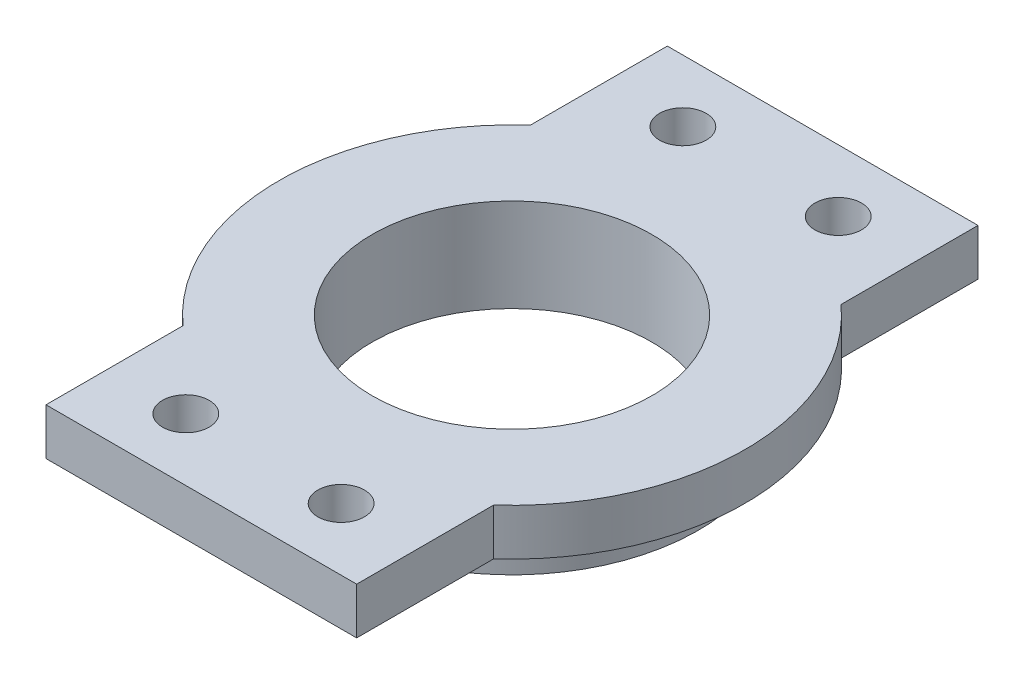
ISO-10303-21;
HEADER;
FILE_DESCRIPTION(('STEP AP214'),'2;1');
FILE_NAME('part.step','',(''),(''),'','','');
FILE_SCHEMA(('AUTOMOTIVE_DESIGN { 1 0 10303 214 1 1 1 1 }'));
ENDSEC;
DATA;
#1=APPLICATION_CONTEXT('core data for automotive mechanical design processes');
#2=APPLICATION_PROTOCOL_DEFINITION('international standard','automotive_design',2000,#1);
#3=PRODUCT_CONTEXT('',#1,'mechanical');
#4=PRODUCT('Part','Part','',(#3));
#5=PRODUCT_RELATED_PRODUCT_CATEGORY('part','',(#4));
#6=PRODUCT_DEFINITION_FORMATION('','',#4);
#7=PRODUCT_DEFINITION_CONTEXT('part definition',#1,'design');
#8=PRODUCT_DEFINITION('design','',#6,#7);
#9=PRODUCT_DEFINITION_SHAPE('','',#8);
#10=(LENGTH_UNIT() NAMED_UNIT(*) SI_UNIT(.MILLI.,.METRE.));
#11=(NAMED_UNIT(*) PLANE_ANGLE_UNIT() SI_UNIT($,.RADIAN.));
#12=(NAMED_UNIT(*) SI_UNIT($,.STERADIAN.) SOLID_ANGLE_UNIT());
#13=UNCERTAINTY_MEASURE_WITH_UNIT(LENGTH_MEASURE(1.E-05),#10,'distance_accuracy_value','');
#14=(GEOMETRIC_REPRESENTATION_CONTEXT(3) GLOBAL_UNCERTAINTY_ASSIGNED_CONTEXT((#13)) GLOBAL_UNIT_ASSIGNED_CONTEXT((#10,
#11,#12)) REPRESENTATION_CONTEXT('',''));
#15=CARTESIAN_POINT('',(0.,0.,0.));
#16=DIRECTION('',(0.,0.,1.));
#17=DIRECTION('',(1.,0.,0.));
#18=AXIS2_PLACEMENT_3D('',#15,#16,#17);
#19=CARTESIAN_POINT('',(0.,0.,0.));
#20=DIRECTION('',(0.,1.,0.));
#21=DIRECTION('',(0.,0.,1.));
#22=AXIS2_PLACEMENT_3D('',#19,#20,#21);
#23=PLANE('',#22);
#24=CARTESIAN_POINT('',(0.,0.,0.));
#25=DIRECTION('',(0.,1.,0.));
#26=DIRECTION('',(0.,0.,1.));
#27=AXIS2_PLACEMENT_3D('',#24,#25,#26);
#28=CIRCLE('',#27,12.);
#29=CARTESIAN_POINT('',(0.,0.,12.));
#30=VERTEX_POINT('',#29);
#31=EDGE_CURVE('E47',#30,#30,#28,.T.);
#32=ORIENTED_EDGE('',*,*,#31,.F.);
#33=EDGE_LOOP('',(#32));
#34=FACE_BOUND('',#33,.T.);
#35=CARTESIAN_POINT('',(0.,0.,0.));
#36=DIRECTION('',(0.,1.,0.));
#37=DIRECTION('',(0.,0.,1.));
#38=AXIS2_PLACEMENT_3D('',#35,#36,#37);
#39=CIRCLE('',#38,9.);
#40=CARTESIAN_POINT('',(0.,0.,9.));
#41=VERTEX_POINT('',#40);
#42=EDGE_CURVE('E194',#41,#41,#39,.T.);
#43=ORIENTED_EDGE('',*,*,#42,.T.);
#44=EDGE_LOOP('',(#43));
#45=FACE_BOUND('',#44,.T.);
#46=ADVANCED_FACE('F44',(#34,#45),#23,.F.);
#47=CARTESIAN_POINT('',(0.,3.,0.));
#48=DIRECTION('',(0.,-1.,0.));
#49=DIRECTION('',(0.,0.,-1.));
#50=AXIS2_PLACEMENT_3D('',#47,#48,#49);
#51=CYLINDRICAL_SURFACE('',#50,12.);
#52=CARTESIAN_POINT('',(0.,3.,0.));
#53=DIRECTION('',(0.,1.,0.));
#54=DIRECTION('',(0.,0.,1.));
#55=AXIS2_PLACEMENT_3D('',#52,#53,#54);
#56=CIRCLE('',#55,12.);
#57=CARTESIAN_POINT('',(0.,3.,12.));
#58=VERTEX_POINT('',#57);
#59=EDGE_CURVE('E11',#58,#58,#56,.T.);
#60=ORIENTED_EDGE('',*,*,#59,.F.);
#61=EDGE_LOOP('',(#60));
#62=FACE_BOUND('',#61,.T.);
#63=ORIENTED_EDGE('',*,*,#31,.T.);
#64=EDGE_LOOP('',(#63));
#65=FACE_BOUND('',#64,.T.);
#66=ADVANCED_FACE('F50',(#62,#65),#51,.T.);
#67=CARTESIAN_POINT('',(0.,3.,0.));
#68=DIRECTION('',(0.,-1.,0.));
#69=DIRECTION('',(0.,0.,-1.));
#70=AXIS2_PLACEMENT_3D('',#67,#68,#69);
#71=CYLINDRICAL_SURFACE('',#70,9.);
#72=ORIENTED_EDGE('',*,*,#42,.F.);
#73=EDGE_LOOP('',(#72));
#74=FACE_BOUND('',#73,.T.);
#75=CARTESIAN_POINT('',(0.,6.,0.));
#76=DIRECTION('',(0.,1.,0.));
#77=DIRECTION('',(0.,0.,1.));
#78=AXIS2_PLACEMENT_3D('',#75,#76,#77);
#79=CIRCLE('',#78,9.);
#80=CARTESIAN_POINT('',(0.,6.,9.));
#81=VERTEX_POINT('',#80);
#82=EDGE_CURVE('E152',#81,#81,#79,.T.);
#83=ORIENTED_EDGE('',*,*,#82,.T.);
#84=EDGE_LOOP('',(#83));
#85=FACE_BOUND('',#84,.T.);
#86=ADVANCED_FACE('F208',(#74,#85),#71,.F.);
#87=CARTESIAN_POINT('',(0.,6.,0.));
#88=DIRECTION('',(0.,1.,0.));
#89=DIRECTION('',(0.,0.,1.));
#90=AXIS2_PLACEMENT_3D('',#87,#88,#89);
#91=PLANE('',#90);
#92=CARTESIAN_POINT('',(-5.,6.,16.));
#93=DIRECTION('',(0.,1.,0.));
#94=DIRECTION('',(0.,0.,1.));
#95=AXIS2_PLACEMENT_3D('',#92,#93,#94);
#96=CIRCLE('',#95,1.5);
#97=CARTESIAN_POINT('',(-5.,6.,17.5));
#98=VERTEX_POINT('',#97);
#99=EDGE_CURVE('E279',#98,#98,#96,.T.);
#100=ORIENTED_EDGE('',*,*,#99,.F.);
#101=EDGE_LOOP('',(#100));
#102=FACE_BOUND('',#101,.T.);
#103=CARTESIAN_POINT('',(-5.,6.,-16.));
#104=DIRECTION('',(0.,1.,0.));
#105=DIRECTION('',(0.,0.,1.));
#106=AXIS2_PLACEMENT_3D('',#103,#104,#105);
#107=CIRCLE('',#106,1.5);
#108=CARTESIAN_POINT('',(-5.,6.,-14.5));
#109=VERTEX_POINT('',#108);
#110=EDGE_CURVE('E294',#109,#109,#107,.T.);
#111=ORIENTED_EDGE('',*,*,#110,.F.);
#112=EDGE_LOOP('',(#111));
#113=FACE_BOUND('',#112,.T.);
#114=CARTESIAN_POINT('',(0.,6.,0.));
#115=DIRECTION('',(0.,1.,0.));
#116=DIRECTION('',(0.,0.,1.));
#117=AXIS2_PLACEMENT_3D('',#114,#115,#116);
#118=CIRCLE('',#117,15.);
#119=CARTESIAN_POINT('',(-10.,6.,-11.1803398874989));
#120=VERTEX_POINT('',#119);
#121=CARTESIAN_POINT('',(-10.,6.,11.1803398874989));
#122=VERTEX_POINT('',#121);
#123=EDGE_CURVE('E174',#120,#122,#118,.T.);
#124=ORIENTED_EDGE('',*,*,#123,.T.);
#125=DIRECTION('',(0.,0.,1.));
#126=VECTOR('',#125,1.);
#127=CARTESIAN_POINT('',(-10.,6.,11.1803398874989));
#128=LINE('',#127,#126);
#129=CARTESIAN_POINT('',(-10.,6.,20.));
#130=VERTEX_POINT('',#129);
#131=EDGE_CURVE('E110',#122,#130,#128,.T.);
#132=ORIENTED_EDGE('',*,*,#131,.T.);
#133=DIRECTION('',(1.,0.,0.));
#134=VECTOR('',#133,1.);
#135=CARTESIAN_POINT('',(-10.,6.,20.));
#136=LINE('',#135,#134);
#137=CARTESIAN_POINT('',(10.,6.,20.));
#138=VERTEX_POINT('',#137);
#139=EDGE_CURVE('E306',#130,#138,#136,.T.);
#140=ORIENTED_EDGE('',*,*,#139,.T.);
#141=DIRECTION('',(0.,0.,-1.));
#142=VECTOR('',#141,1.);
#143=CARTESIAN_POINT('',(10.,6.,11.180339887499));
#144=LINE('',#143,#142);
#145=CARTESIAN_POINT('',(10.,6.,11.1803398874989));
#146=VERTEX_POINT('',#145);
#147=EDGE_CURVE('E313',#138,#146,#144,.T.);
#148=ORIENTED_EDGE('',*,*,#147,.T.);
#149=CARTESIAN_POINT('',(0.,6.,0.));
#150=DIRECTION('',(0.,1.,0.));
#151=DIRECTION('',(0.,0.,1.));
#152=AXIS2_PLACEMENT_3D('',#149,#150,#151);
#153=CIRCLE('',#152,15.);
#154=CARTESIAN_POINT('',(10.,6.,-11.180339887499));
#155=VERTEX_POINT('',#154);
#156=EDGE_CURVE('E130',#146,#155,#153,.T.);
#157=ORIENTED_EDGE('',*,*,#156,.T.);
#158=DIRECTION('',(0.,0.,-1.));
#159=VECTOR('',#158,1.);
#160=CARTESIAN_POINT('',(10.,6.,-20.));
#161=LINE('',#160,#159);
#162=CARTESIAN_POINT('',(10.,6.,-20.));
#163=VERTEX_POINT('',#162);
#164=EDGE_CURVE('E116',#155,#163,#161,.T.);
#165=ORIENTED_EDGE('',*,*,#164,.T.);
#166=DIRECTION('',(-1.,0.,0.));
#167=VECTOR('',#166,1.);
#168=CARTESIAN_POINT('',(-10.,6.,-20.));
#169=LINE('',#168,#167);
#170=CARTESIAN_POINT('',(-10.,6.,-20.));
#171=VERTEX_POINT('',#170);
#172=EDGE_CURVE('E121',#163,#171,#169,.T.);
#173=ORIENTED_EDGE('',*,*,#172,.T.);
#174=DIRECTION('',(0.,0.,1.));
#175=VECTOR('',#174,1.);
#176=CARTESIAN_POINT('',(-10.,6.,-20.));
#177=LINE('',#176,#175);
#178=EDGE_CURVE('E62',#171,#120,#177,.T.);
#179=ORIENTED_EDGE('',*,*,#178,.T.);
#180=EDGE_LOOP('',(#124,#132,#140,#148,#157,#165,#173,#179));
#181=FACE_BOUND('',#180,.T.);
#182=ORIENTED_EDGE('',*,*,#82,.F.);
#183=EDGE_LOOP('',(#182));
#184=FACE_BOUND('',#183,.T.);
#185=CARTESIAN_POINT('',(5.,6.,-16.));
#186=DIRECTION('',(0.,1.,0.));
#187=DIRECTION('',(0.,0.,1.));
#188=AXIS2_PLACEMENT_3D('',#185,#186,#187);
#189=CIRCLE('',#188,1.5);
#190=CARTESIAN_POINT('',(5.,6.,-14.5));
#191=VERTEX_POINT('',#190);
#192=EDGE_CURVE('E287',#191,#191,#189,.T.);
#193=ORIENTED_EDGE('',*,*,#192,.F.);
#194=EDGE_LOOP('',(#193));
#195=FACE_BOUND('',#194,.T.);
#196=CARTESIAN_POINT('',(5.,6.,16.));
#197=DIRECTION('',(0.,1.,0.));
#198=DIRECTION('',(0.,0.,1.));
#199=AXIS2_PLACEMENT_3D('',#196,#197,#198);
#200=CIRCLE('',#199,1.5);
#201=CARTESIAN_POINT('',(5.,6.,17.5));
#202=VERTEX_POINT('',#201);
#203=EDGE_CURVE('E270',#202,#202,#200,.T.);
#204=ORIENTED_EDGE('',*,*,#203,.F.);
#205=EDGE_LOOP('',(#204));
#206=FACE_BOUND('',#205,.T.);
#207=ADVANCED_FACE('F125',(#102,#113,#181,#184,#195,#206),#91,.T.);
#208=CARTESIAN_POINT('',(0.,3.,0.));
#209=DIRECTION('',(0.,1.,0.));
#210=DIRECTION('',(0.,0.,1.));
#211=AXIS2_PLACEMENT_3D('',#208,#209,#210);
#212=PLANE('',#211);
#213=ORIENTED_EDGE('',*,*,#59,.T.);
#214=EDGE_LOOP('',(#213));
#215=FACE_BOUND('',#214,.T.);
#216=CARTESIAN_POINT('',(0.,3.,0.));
#217=DIRECTION('',(0.,1.,0.));
#218=DIRECTION('',(0.,0.,1.));
#219=AXIS2_PLACEMENT_3D('',#216,#217,#218);
#220=CIRCLE('',#219,15.);
#221=CARTESIAN_POINT('',(-10.,3.,-11.1803398874989));
#222=VERTEX_POINT('',#221);
#223=CARTESIAN_POINT('',(-10.,3.,11.1803398874989));
#224=VERTEX_POINT('',#223);
#225=EDGE_CURVE('E149',#222,#224,#220,.T.);
#226=ORIENTED_EDGE('',*,*,#225,.F.);
#227=DIRECTION('',(0.,0.,1.));
#228=VECTOR('',#227,1.);
#229=CARTESIAN_POINT('',(-10.,3.,-20.));
#230=LINE('',#229,#228);
#231=CARTESIAN_POINT('',(-10.,3.,-20.));
#232=VERTEX_POINT('',#231);
#233=EDGE_CURVE('E98',#232,#222,#230,.T.);
#234=ORIENTED_EDGE('',*,*,#233,.F.);
#235=DIRECTION('',(-1.,0.,0.));
#236=VECTOR('',#235,1.);
#237=CARTESIAN_POINT('',(-10.,3.,-20.));
#238=LINE('',#237,#236);
#239=CARTESIAN_POINT('',(10.,3.,-20.));
#240=VERTEX_POINT('',#239);
#241=EDGE_CURVE('E95',#240,#232,#238,.T.);
#242=ORIENTED_EDGE('',*,*,#241,.F.);
#243=DIRECTION('',(0.,0.,-1.));
#244=VECTOR('',#243,1.);
#245=CARTESIAN_POINT('',(10.,3.,-20.));
#246=LINE('',#245,#244);
#247=CARTESIAN_POINT('',(10.,3.,-11.180339887499));
#248=VERTEX_POINT('',#247);
#249=EDGE_CURVE('E137',#248,#240,#246,.T.);
#250=ORIENTED_EDGE('',*,*,#249,.F.);
#251=CARTESIAN_POINT('',(0.,3.,0.));
#252=DIRECTION('',(0.,1.,0.));
#253=DIRECTION('',(0.,0.,1.));
#254=AXIS2_PLACEMENT_3D('',#251,#252,#253);
#255=CIRCLE('',#254,15.);
#256=CARTESIAN_POINT('',(10.,3.,11.1803398874989));
#257=VERTEX_POINT('',#256);
#258=EDGE_CURVE('E162',#257,#248,#255,.T.);
#259=ORIENTED_EDGE('',*,*,#258,.F.);
#260=DIRECTION('',(0.,0.,-1.));
#261=VECTOR('',#260,1.);
#262=CARTESIAN_POINT('',(10.,3.,11.180339887499));
#263=LINE('',#262,#261);
#264=CARTESIAN_POINT('',(10.,3.,20.));
#265=VERTEX_POINT('',#264);
#266=EDGE_CURVE('E159',#265,#257,#263,.T.);
#267=ORIENTED_EDGE('',*,*,#266,.F.);
#268=DIRECTION('',(1.,0.,0.));
#269=VECTOR('',#268,1.);
#270=CARTESIAN_POINT('',(-10.,3.,20.));
#271=LINE('',#270,#269);
#272=CARTESIAN_POINT('',(-10.,3.,20.));
#273=VERTEX_POINT('',#272);
#274=EDGE_CURVE('E160',#273,#265,#271,.T.);
#275=ORIENTED_EDGE('',*,*,#274,.F.);
#276=DIRECTION('',(0.,0.,1.));
#277=VECTOR('',#276,1.);
#278=CARTESIAN_POINT('',(-10.,3.,11.1803398874989));
#279=LINE('',#278,#277);
#280=EDGE_CURVE('E153',#224,#273,#279,.T.);
#281=ORIENTED_EDGE('',*,*,#280,.F.);
#282=EDGE_LOOP('',(#226,#234,#242,#250,#259,#267,#275,#281));
#283=FACE_BOUND('',#282,.T.);
#284=CARTESIAN_POINT('',(-5.,3.,-16.));
#285=DIRECTION('',(0.,1.,0.));
#286=DIRECTION('',(0.,0.,1.));
#287=AXIS2_PLACEMENT_3D('',#284,#285,#286);
#288=CIRCLE('',#287,1.5);
#289=CARTESIAN_POINT('',(-5.,3.,-14.5));
#290=VERTEX_POINT('',#289);
#291=EDGE_CURVE('E286',#290,#290,#288,.T.);
#292=ORIENTED_EDGE('',*,*,#291,.T.);
#293=EDGE_LOOP('',(#292));
#294=FACE_BOUND('',#293,.T.);
#295=CARTESIAN_POINT('',(5.,3.,-16.));
#296=DIRECTION('',(0.,1.,0.));
#297=DIRECTION('',(0.,0.,1.));
#298=AXIS2_PLACEMENT_3D('',#295,#296,#297);
#299=CIRCLE('',#298,1.5);
#300=CARTESIAN_POINT('',(5.,3.,-14.5));
#301=VERTEX_POINT('',#300);
#302=EDGE_CURVE('E284',#301,#301,#299,.T.);
#303=ORIENTED_EDGE('',*,*,#302,.T.);
#304=EDGE_LOOP('',(#303));
#305=FACE_BOUND('',#304,.T.);
#306=CARTESIAN_POINT('',(-5.,3.,16.));
#307=DIRECTION('',(0.,1.,0.));
#308=DIRECTION('',(0.,0.,1.));
#309=AXIS2_PLACEMENT_3D('',#306,#307,#308);
#310=CIRCLE('',#309,1.5);
#311=CARTESIAN_POINT('',(-5.,3.,17.5));
#312=VERTEX_POINT('',#311);
#313=EDGE_CURVE('E274',#312,#312,#310,.T.);
#314=ORIENTED_EDGE('',*,*,#313,.T.);
#315=EDGE_LOOP('',(#314));
#316=FACE_BOUND('',#315,.T.);
#317=CARTESIAN_POINT('',(5.,3.,16.));
#318=DIRECTION('',(0.,1.,0.));
#319=DIRECTION('',(0.,0.,1.));
#320=AXIS2_PLACEMENT_3D('',#317,#318,#319);
#321=CIRCLE('',#320,1.5);
#322=CARTESIAN_POINT('',(5.,3.,17.5));
#323=VERTEX_POINT('',#322);
#324=EDGE_CURVE('E269',#323,#323,#321,.T.);
#325=ORIENTED_EDGE('',*,*,#324,.T.);
#326=EDGE_LOOP('',(#325));
#327=FACE_BOUND('',#326,.T.);
#328=ADVANCED_FACE('F217',(#215,#283,#294,#305,#316,#327),#212,.F.);
#329=CARTESIAN_POINT('',(0.,6.,0.));
#330=DIRECTION('',(0.,-1.,0.));
#331=DIRECTION('',(0.,0.,-1.));
#332=AXIS2_PLACEMENT_3D('',#329,#330,#331);
#333=CYLINDRICAL_SURFACE('',#332,15.);
#334=ORIENTED_EDGE('',*,*,#225,.T.);
#335=DIRECTION('',(0.,-1.,0.));
#336=VECTOR('',#335,1.);
#337=CARTESIAN_POINT('',(-10.,6.,11.1803398874989));
#338=LINE('',#337,#336);
#339=EDGE_CURVE('E192',#122,#224,#338,.T.);
#340=ORIENTED_EDGE('',*,*,#339,.F.);
#341=ORIENTED_EDGE('',*,*,#123,.F.);
#342=DIRECTION('',(0.,-1.,0.));
#343=VECTOR('',#342,1.);
#344=CARTESIAN_POINT('',(-10.,6.,-11.1803398874989));
#345=LINE('',#344,#343);
#346=EDGE_CURVE('E144',#120,#222,#345,.T.);
#347=ORIENTED_EDGE('',*,*,#346,.T.);
#348=EDGE_LOOP('',(#334,#340,#341,#347));
#349=FACE_BOUND('',#348,.T.);
#350=ADVANCED_FACE('F212',(#349),#333,.T.);
#351=CARTESIAN_POINT('',(-10.,6.,11.1803398874989));
#352=DIRECTION('',(1.,0.,0.));
#353=DIRECTION('',(0.,0.,-1.));
#354=AXIS2_PLACEMENT_3D('',#351,#352,#353);
#355=PLANE('',#354);
#356=ORIENTED_EDGE('',*,*,#280,.T.);
#357=DIRECTION('',(0.,-1.,0.));
#358=VECTOR('',#357,1.);
#359=CARTESIAN_POINT('',(-10.,6.,20.));
#360=LINE('',#359,#358);
#361=EDGE_CURVE('E189',#130,#273,#360,.T.);
#362=ORIENTED_EDGE('',*,*,#361,.F.);
#363=ORIENTED_EDGE('',*,*,#131,.F.);
#364=ORIENTED_EDGE('',*,*,#339,.T.);
#365=EDGE_LOOP('',(#356,#362,#363,#364));
#366=FACE_BOUND('',#365,.T.);
#367=ADVANCED_FACE('F220',(#366),#355,.F.);
#368=CARTESIAN_POINT('',(-10.,6.,20.));
#369=DIRECTION('',(0.,0.,-1.));
#370=DIRECTION('',(-1.,0.,0.));
#371=AXIS2_PLACEMENT_3D('',#368,#369,#370);
#372=PLANE('',#371);
#373=ORIENTED_EDGE('',*,*,#274,.T.);
#374=DIRECTION('',(0.,-1.,0.));
#375=VECTOR('',#374,1.);
#376=CARTESIAN_POINT('',(10.,6.,20.));
#377=LINE('',#376,#375);
#378=EDGE_CURVE('E181',#138,#265,#377,.T.);
#379=ORIENTED_EDGE('',*,*,#378,.F.);
#380=ORIENTED_EDGE('',*,*,#139,.F.);
#381=ORIENTED_EDGE('',*,*,#361,.T.);
#382=EDGE_LOOP('',(#373,#379,#380,#381));
#383=FACE_BOUND('',#382,.T.);
#384=ADVANCED_FACE('F225',(#383),#372,.F.);
#385=CARTESIAN_POINT('',(10.,6.,11.180339887499));
#386=DIRECTION('',(-1.,0.,0.));
#387=DIRECTION('',(0.,0.,1.));
#388=AXIS2_PLACEMENT_3D('',#385,#386,#387);
#389=PLANE('',#388);
#390=ORIENTED_EDGE('',*,*,#266,.T.);
#391=DIRECTION('',(0.,-1.,0.));
#392=VECTOR('',#391,1.);
#393=CARTESIAN_POINT('',(10.,6.,11.1803398874989));
#394=LINE('',#393,#392);
#395=EDGE_CURVE('E179',#146,#257,#394,.T.);
#396=ORIENTED_EDGE('',*,*,#395,.F.);
#397=ORIENTED_EDGE('',*,*,#147,.F.);
#398=ORIENTED_EDGE('',*,*,#378,.T.);
#399=EDGE_LOOP('',(#390,#396,#397,#398));
#400=FACE_BOUND('',#399,.T.);
#401=ADVANCED_FACE('F223',(#400),#389,.F.);
#402=CARTESIAN_POINT('',(0.,6.,0.));
#403=DIRECTION('',(0.,-1.,0.));
#404=DIRECTION('',(0.,0.,-1.));
#405=AXIS2_PLACEMENT_3D('',#402,#403,#404);
#406=CYLINDRICAL_SURFACE('',#405,15.);
#407=ORIENTED_EDGE('',*,*,#258,.T.);
#408=DIRECTION('',(0.,-1.,0.));
#409=VECTOR('',#408,1.);
#410=CARTESIAN_POINT('',(10.,6.,-11.180339887499));
#411=LINE('',#410,#409);
#412=EDGE_CURVE('E138',#155,#248,#411,.T.);
#413=ORIENTED_EDGE('',*,*,#412,.F.);
#414=ORIENTED_EDGE('',*,*,#156,.F.);
#415=ORIENTED_EDGE('',*,*,#395,.T.);
#416=EDGE_LOOP('',(#407,#413,#414,#415));
#417=FACE_BOUND('',#416,.T.);
#418=ADVANCED_FACE('F230',(#417),#406,.T.);
#419=CARTESIAN_POINT('',(10.,6.,-20.));
#420=DIRECTION('',(-1.,0.,0.));
#421=DIRECTION('',(0.,0.,1.));
#422=AXIS2_PLACEMENT_3D('',#419,#420,#421);
#423=PLANE('',#422);
#424=ORIENTED_EDGE('',*,*,#249,.T.);
#425=DIRECTION('',(0.,-1.,0.));
#426=VECTOR('',#425,1.);
#427=CARTESIAN_POINT('',(10.,6.,-20.));
#428=LINE('',#427,#426);
#429=EDGE_CURVE('E132',#163,#240,#428,.T.);
#430=ORIENTED_EDGE('',*,*,#429,.F.);
#431=ORIENTED_EDGE('',*,*,#164,.F.);
#432=ORIENTED_EDGE('',*,*,#412,.T.);
#433=EDGE_LOOP('',(#424,#430,#431,#432));
#434=FACE_BOUND('',#433,.T.);
#435=ADVANCED_FACE('F135',(#434),#423,.F.);
#436=CARTESIAN_POINT('',(-10.,6.,-20.));
#437=DIRECTION('',(0.,0.,1.));
#438=DIRECTION('',(1.,0.,0.));
#439=AXIS2_PLACEMENT_3D('',#436,#437,#438);
#440=PLANE('',#439);
#441=ORIENTED_EDGE('',*,*,#241,.T.);
#442=DIRECTION('',(0.,-1.,0.));
#443=VECTOR('',#442,1.);
#444=CARTESIAN_POINT('',(-10.,6.,-20.));
#445=LINE('',#444,#443);
#446=EDGE_CURVE('E139',#171,#232,#445,.T.);
#447=ORIENTED_EDGE('',*,*,#446,.F.);
#448=ORIENTED_EDGE('',*,*,#172,.F.);
#449=ORIENTED_EDGE('',*,*,#429,.T.);
#450=EDGE_LOOP('',(#441,#447,#448,#449));
#451=FACE_BOUND('',#450,.T.);
#452=ADVANCED_FACE('F143',(#451),#440,.F.);
#453=CARTESIAN_POINT('',(-10.,6.,-20.));
#454=DIRECTION('',(1.,0.,0.));
#455=DIRECTION('',(0.,0.,-1.));
#456=AXIS2_PLACEMENT_3D('',#453,#454,#455);
#457=PLANE('',#456);
#458=ORIENTED_EDGE('',*,*,#233,.T.);
#459=ORIENTED_EDGE('',*,*,#346,.F.);
#460=ORIENTED_EDGE('',*,*,#178,.F.);
#461=ORIENTED_EDGE('',*,*,#446,.T.);
#462=EDGE_LOOP('',(#458,#459,#460,#461));
#463=FACE_BOUND('',#462,.T.);
#464=ADVANCED_FACE('F236',(#463),#457,.F.);
#465=CARTESIAN_POINT('',(-5.,6.,-16.));
#466=DIRECTION('',(0.,-1.,0.));
#467=DIRECTION('',(0.,0.,-1.));
#468=AXIS2_PLACEMENT_3D('',#465,#466,#467);
#469=CYLINDRICAL_SURFACE('',#468,1.5);
#470=ORIENTED_EDGE('',*,*,#110,.T.);
#471=EDGE_LOOP('',(#470));
#472=FACE_BOUND('',#471,.T.);
#473=ORIENTED_EDGE('',*,*,#291,.F.);
#474=EDGE_LOOP('',(#473));
#475=FACE_BOUND('',#474,.T.);
#476=ADVANCED_FACE('F243',(#472,#475),#469,.F.);
#477=CARTESIAN_POINT('',(5.,6.,-16.));
#478=DIRECTION('',(0.,-1.,0.));
#479=DIRECTION('',(0.,0.,-1.));
#480=AXIS2_PLACEMENT_3D('',#477,#478,#479);
#481=CYLINDRICAL_SURFACE('',#480,1.5);
#482=ORIENTED_EDGE('',*,*,#192,.T.);
#483=EDGE_LOOP('',(#482));
#484=FACE_BOUND('',#483,.T.);
#485=ORIENTED_EDGE('',*,*,#302,.F.);
#486=EDGE_LOOP('',(#485));
#487=FACE_BOUND('',#486,.T.);
#488=ADVANCED_FACE('F246',(#484,#487),#481,.F.);
#489=CARTESIAN_POINT('',(-5.,6.,16.));
#490=DIRECTION('',(0.,-1.,0.));
#491=DIRECTION('',(0.,0.,-1.));
#492=AXIS2_PLACEMENT_3D('',#489,#490,#491);
#493=CYLINDRICAL_SURFACE('',#492,1.5);
#494=ORIENTED_EDGE('',*,*,#99,.T.);
#495=EDGE_LOOP('',(#494));
#496=FACE_BOUND('',#495,.T.);
#497=ORIENTED_EDGE('',*,*,#313,.F.);
#498=EDGE_LOOP('',(#497));
#499=FACE_BOUND('',#498,.T.);
#500=ADVANCED_FACE('F255',(#496,#499),#493,.F.);
#501=CARTESIAN_POINT('',(5.,6.,16.));
#502=DIRECTION('',(0.,-1.,0.));
#503=DIRECTION('',(0.,0.,-1.));
#504=AXIS2_PLACEMENT_3D('',#501,#502,#503);
#505=CYLINDRICAL_SURFACE('',#504,1.5);
#506=ORIENTED_EDGE('',*,*,#203,.T.);
#507=EDGE_LOOP('',(#506));
#508=FACE_BOUND('',#507,.T.);
#509=ORIENTED_EDGE('',*,*,#324,.F.);
#510=EDGE_LOOP('',(#509));
#511=FACE_BOUND('',#510,.T.);
#512=ADVANCED_FACE('F256',(#508,#511),#505,.F.);
#513=CLOSED_SHELL('',(#46,#66,#86,#207,#328,#350,#367,#384,#401,#418,#435,#452,#464,#476,#488,
#500,#512));
#514=MANIFOLD_SOLID_BREP('B2',#513);
#515=ADVANCED_BREP_SHAPE_REPRESENTATION('',(#18,#514),#14);
#516=SHAPE_DEFINITION_REPRESENTATION(#9,#515);
ENDSEC;
END-ISO-10303-21;
